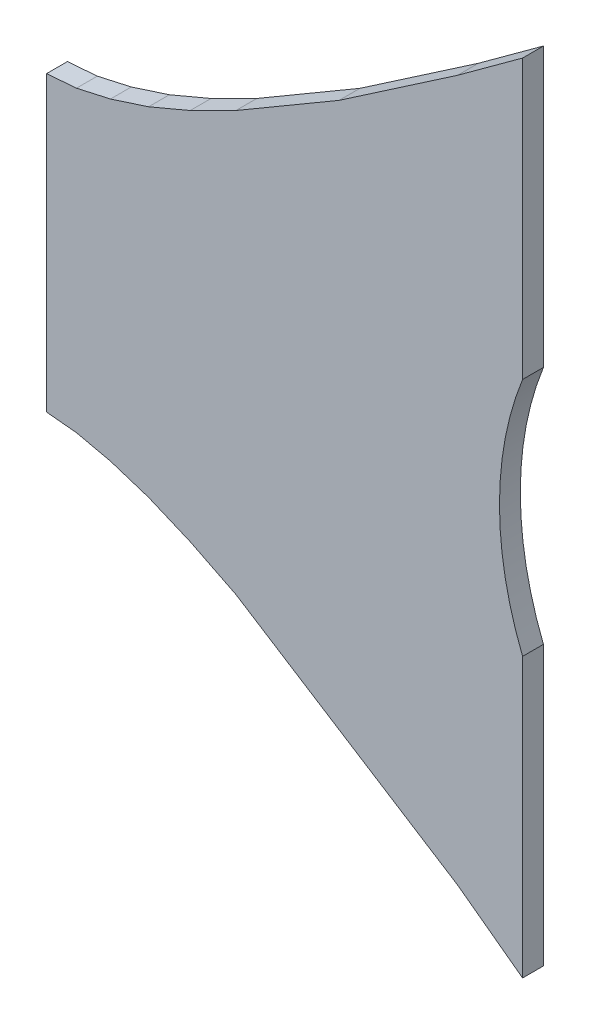
ISO-10303-21;
HEADER;
FILE_DESCRIPTION(('STEP AP214'),'2;1');
FILE_NAME('part.step','',(''),(''),'','','');
FILE_SCHEMA(('AUTOMOTIVE_DESIGN { 1 0 10303 214 1 1 1 1 }'));
ENDSEC;
DATA;
#1=APPLICATION_CONTEXT('core data for automotive mechanical design processes');
#2=APPLICATION_PROTOCOL_DEFINITION('international standard','automotive_design',2000,#1);
#3=PRODUCT_CONTEXT('',#1,'mechanical');
#4=PRODUCT('Part','Part','',(#3));
#5=PRODUCT_RELATED_PRODUCT_CATEGORY('part','',(#4));
#6=PRODUCT_DEFINITION_FORMATION('','',#4);
#7=PRODUCT_DEFINITION_CONTEXT('part definition',#1,'design');
#8=PRODUCT_DEFINITION('design','',#6,#7);
#9=PRODUCT_DEFINITION_SHAPE('','',#8);
#10=(LENGTH_UNIT() NAMED_UNIT(*) SI_UNIT(.MILLI.,.METRE.));
#11=(NAMED_UNIT(*) PLANE_ANGLE_UNIT() SI_UNIT($,.RADIAN.));
#12=(NAMED_UNIT(*) SI_UNIT($,.STERADIAN.) SOLID_ANGLE_UNIT());
#13=UNCERTAINTY_MEASURE_WITH_UNIT(LENGTH_MEASURE(1.E-05),#10,'distance_accuracy_value','');
#14=(GEOMETRIC_REPRESENTATION_CONTEXT(3) GLOBAL_UNCERTAINTY_ASSIGNED_CONTEXT((#13)) GLOBAL_UNIT_ASSIGNED_CONTEXT((#10,
#11,#12)) REPRESENTATION_CONTEXT('',''));
#15=CARTESIAN_POINT('',(0.,0.,0.));
#16=DIRECTION('',(0.,0.,1.));
#17=DIRECTION('',(1.,0.,0.));
#18=AXIS2_PLACEMENT_3D('',#15,#16,#17);
#19=CARTESIAN_POINT('',(102.249000549316,66.4869995117188,0.));
#20=DIRECTION('',(1.,0.,0.));
#21=DIRECTION('',(0.,-1.,0.));
#22=AXIS2_PLACEMENT_3D('',#19,#20,#21);
#23=PLANE('',#22);
#24=DIRECTION('',(0.,-1.,0.));
#25=VECTOR('',#24,1.);
#26=CARTESIAN_POINT('',(102.249000549316,66.4869995117188,0.03556));
#27=LINE('',#26,#25);
#28=CARTESIAN_POINT('',(102.249000549316,66.4869995117188,0.03556));
#29=VERTEX_POINT('',#28);
#30=CARTESIAN_POINT('',(102.249000549316,65.9869995117188,0.03556));
#31=VERTEX_POINT('',#30);
#32=EDGE_CURVE('E11',#29,#31,#27,.T.);
#33=ORIENTED_EDGE('',*,*,#32,.F.);
#34=DIRECTION('',(0.,0.,1.));
#35=VECTOR('',#34,1.);
#36=CARTESIAN_POINT('',(102.249000549316,66.4869995117188,0.));
#37=LINE('',#36,#35);
#38=CARTESIAN_POINT('',(102.249000549316,66.4869995117188,0.));
#39=VERTEX_POINT('',#38);
#40=EDGE_CURVE('E24',#39,#29,#37,.T.);
#41=ORIENTED_EDGE('',*,*,#40,.F.);
#42=DIRECTION('',(0.,-1.,0.));
#43=VECTOR('',#42,1.);
#44=CARTESIAN_POINT('',(102.249000549316,66.4869995117188,0.));
#45=LINE('',#44,#43);
#46=CARTESIAN_POINT('',(102.249000549316,65.9869995117188,0.));
#47=VERTEX_POINT('',#46);
#48=EDGE_CURVE('E297',#39,#47,#45,.T.);
#49=ORIENTED_EDGE('',*,*,#48,.T.);
#50=DIRECTION('',(0.,0.,1.));
#51=VECTOR('',#50,1.);
#52=CARTESIAN_POINT('',(102.249000549316,65.9869995117188,0.));
#53=LINE('',#52,#51);
#54=EDGE_CURVE('E37',#47,#31,#53,.T.);
#55=ORIENTED_EDGE('',*,*,#54,.T.);
#56=EDGE_LOOP('',(#33,#41,#49,#55));
#57=FACE_BOUND('',#56,.T.);
#58=ADVANCED_FACE('F17',(#57),#23,.F.);
#59=CARTESIAN_POINT('',(102.300003051758,66.4909973144531,0.));
#60=DIRECTION('',(0.0781447450221444,-0.996942023803503,0.));
#61=DIRECTION('',(-0.996942023803503,-0.0781447450221444,0.));
#62=AXIS2_PLACEMENT_3D('',#59,#60,#61);
#63=PLANE('',#62);
#64=DIRECTION('',(-0.996942023803503,-0.0781447450221444,0.));
#65=VECTOR('',#64,1.);
#66=CARTESIAN_POINT('',(102.300003051758,66.4909973144531,0.03556));
#67=LINE('',#66,#65);
#68=CARTESIAN_POINT('',(102.300003051758,66.4909973144531,0.03556));
#69=VERTEX_POINT('',#68);
#70=EDGE_CURVE('E293',#69,#29,#67,.T.);
#71=ORIENTED_EDGE('',*,*,#70,.F.);
#72=DIRECTION('',(0.,0.,1.));
#73=VECTOR('',#72,1.);
#74=CARTESIAN_POINT('',(102.300003051758,66.4909973144531,0.));
#75=LINE('',#74,#73);
#76=CARTESIAN_POINT('',(102.300003051758,66.4909973144531,0.));
#77=VERTEX_POINT('',#76);
#78=EDGE_CURVE('E291',#77,#69,#75,.T.);
#79=ORIENTED_EDGE('',*,*,#78,.F.);
#80=DIRECTION('',(-0.996942023803503,-0.0781447450221444,0.));
#81=VECTOR('',#80,1.);
#82=CARTESIAN_POINT('',(102.300003051758,66.4909973144531,0.));
#83=LINE('',#82,#81);
#84=EDGE_CURVE('E289',#77,#39,#83,.T.);
#85=ORIENTED_EDGE('',*,*,#84,.T.);
#86=ORIENTED_EDGE('',*,*,#40,.T.);
#87=EDGE_LOOP('',(#71,#79,#85,#86));
#88=FACE_BOUND('',#87,.T.);
#89=ADVANCED_FACE('F300',(#88),#63,.F.);
#90=CARTESIAN_POINT('',(102.358001708984,66.5039978027344,0.));
#91=DIRECTION('',(0.218724100263412,-0.97578674307656,0.));
#92=DIRECTION('',(-0.97578674307656,-0.218724100263412,0.));
#93=AXIS2_PLACEMENT_3D('',#90,#91,#92);
#94=PLANE('',#93);
#95=DIRECTION('',(-0.97578674307656,-0.218724100263412,0.));
#96=VECTOR('',#95,1.);
#97=CARTESIAN_POINT('',(102.358001708984,66.5039978027344,0.03556));
#98=LINE('',#97,#96);
#99=CARTESIAN_POINT('',(102.358001708984,66.5039978027344,0.03556));
#100=VERTEX_POINT('',#99);
#101=EDGE_CURVE('E286',#100,#69,#98,.T.);
#102=ORIENTED_EDGE('',*,*,#101,.F.);
#103=DIRECTION('',(0.,0.,1.));
#104=VECTOR('',#103,1.);
#105=CARTESIAN_POINT('',(102.358001708984,66.5039978027344,0.));
#106=LINE('',#105,#104);
#107=CARTESIAN_POINT('',(102.358001708984,66.5039978027344,0.));
#108=VERTEX_POINT('',#107);
#109=EDGE_CURVE('E284',#108,#100,#106,.T.);
#110=ORIENTED_EDGE('',*,*,#109,.F.);
#111=DIRECTION('',(-0.97578674307656,-0.218724100263412,0.));
#112=VECTOR('',#111,1.);
#113=CARTESIAN_POINT('',(102.358001708984,66.5039978027344,0.));
#114=LINE('',#113,#112);
#115=EDGE_CURVE('E281',#108,#77,#114,.T.);
#116=ORIENTED_EDGE('',*,*,#115,.T.);
#117=ORIENTED_EDGE('',*,*,#78,.T.);
#118=EDGE_LOOP('',(#102,#110,#116,#117));
#119=FACE_BOUND('',#118,.T.);
#120=ADVANCED_FACE('F303',(#119),#94,.F.);
#121=CARTESIAN_POINT('',(102.422996520996,66.5250015258789,0.));
#122=DIRECTION('',(0.307502058352941,-0.951547415586162,0.));
#123=DIRECTION('',(-0.951547415586162,-0.307502058352941,0.));
#124=AXIS2_PLACEMENT_3D('',#121,#122,#123);
#125=PLANE('',#124);
#126=DIRECTION('',(-0.951547415586162,-0.307502058352941,0.));
#127=VECTOR('',#126,1.);
#128=CARTESIAN_POINT('',(102.422996520996,66.5250015258789,0.03556));
#129=LINE('',#128,#127);
#130=CARTESIAN_POINT('',(102.422996520996,66.5250015258789,0.03556));
#131=VERTEX_POINT('',#130);
#132=EDGE_CURVE('E278',#131,#100,#129,.T.);
#133=ORIENTED_EDGE('',*,*,#132,.F.);
#134=DIRECTION('',(0.,0.,1.));
#135=VECTOR('',#134,1.);
#136=CARTESIAN_POINT('',(102.422996520996,66.5250015258789,0.));
#137=LINE('',#136,#135);
#138=CARTESIAN_POINT('',(102.422996520996,66.5250015258789,0.));
#139=VERTEX_POINT('',#138);
#140=EDGE_CURVE('E276',#139,#131,#137,.T.);
#141=ORIENTED_EDGE('',*,*,#140,.F.);
#142=DIRECTION('',(-0.951547415586162,-0.307502058352941,0.));
#143=VECTOR('',#142,1.);
#144=CARTESIAN_POINT('',(102.422996520996,66.5250015258789,0.));
#145=LINE('',#144,#143);
#146=EDGE_CURVE('E273',#139,#108,#145,.T.);
#147=ORIENTED_EDGE('',*,*,#146,.T.);
#148=ORIENTED_EDGE('',*,*,#109,.T.);
#149=EDGE_LOOP('',(#133,#141,#147,#148));
#150=FACE_BOUND('',#149,.T.);
#151=ADVANCED_FACE('F308',(#150),#125,.F.);
#152=CARTESIAN_POINT('',(102.494003295898,66.5550003051758,0.));
#153=DIRECTION('',(0.389171762664028,-0.921165207302672,0.));
#154=DIRECTION('',(-0.921165207302672,-0.389171762664028,0.));
#155=AXIS2_PLACEMENT_3D('',#152,#153,#154);
#156=PLANE('',#155);
#157=DIRECTION('',(-0.921165207302672,-0.389171762664028,0.));
#158=VECTOR('',#157,1.);
#159=CARTESIAN_POINT('',(102.494003295898,66.5550003051758,0.03556));
#160=LINE('',#159,#158);
#161=CARTESIAN_POINT('',(102.494003295898,66.5550003051758,0.03556));
#162=VERTEX_POINT('',#161);
#163=EDGE_CURVE('E270',#162,#131,#160,.T.);
#164=ORIENTED_EDGE('',*,*,#163,.F.);
#165=DIRECTION('',(0.,0.,1.));
#166=VECTOR('',#165,1.);
#167=CARTESIAN_POINT('',(102.494003295898,66.5550003051758,0.));
#168=LINE('',#167,#166);
#169=CARTESIAN_POINT('',(102.494003295898,66.5550003051758,0.));
#170=VERTEX_POINT('',#169);
#171=EDGE_CURVE('E268',#170,#162,#168,.T.);
#172=ORIENTED_EDGE('',*,*,#171,.F.);
#173=DIRECTION('',(-0.921165207302672,-0.389171762664028,0.));
#174=VECTOR('',#173,1.);
#175=CARTESIAN_POINT('',(102.494003295898,66.5550003051758,0.));
#176=LINE('',#175,#174);
#177=EDGE_CURVE('E265',#170,#139,#176,.T.);
#178=ORIENTED_EDGE('',*,*,#177,.T.);
#179=ORIENTED_EDGE('',*,*,#140,.T.);
#180=EDGE_LOOP('',(#164,#172,#178,#179));
#181=FACE_BOUND('',#180,.T.);
#182=ADVANCED_FACE('F311',(#181),#156,.F.);
#183=CARTESIAN_POINT('',(102.571998596191,66.5940017700195,0.));
#184=DIRECTION('',(0.447248591135036,-0.894409692326579,0.));
#185=DIRECTION('',(-0.894409692326579,-0.447248591135036,0.));
#186=AXIS2_PLACEMENT_3D('',#183,#184,#185);
#187=PLANE('',#186);
#188=DIRECTION('',(-0.894409692326579,-0.447248591135036,0.));
#189=VECTOR('',#188,1.);
#190=CARTESIAN_POINT('',(102.571998596191,66.5940017700195,0.03556));
#191=LINE('',#190,#189);
#192=CARTESIAN_POINT('',(102.571998596191,66.5940017700195,0.03556));
#193=VERTEX_POINT('',#192);
#194=EDGE_CURVE('E262',#193,#162,#191,.T.);
#195=ORIENTED_EDGE('',*,*,#194,.F.);
#196=DIRECTION('',(0.,0.,1.));
#197=VECTOR('',#196,1.);
#198=CARTESIAN_POINT('',(102.571998596191,66.5940017700195,0.));
#199=LINE('',#198,#197);
#200=CARTESIAN_POINT('',(102.571998596191,66.5940017700195,0.));
#201=VERTEX_POINT('',#200);
#202=EDGE_CURVE('E260',#201,#193,#199,.T.);
#203=ORIENTED_EDGE('',*,*,#202,.F.);
#204=DIRECTION('',(-0.894409692326579,-0.447248591135036,0.));
#205=VECTOR('',#204,1.);
#206=CARTESIAN_POINT('',(102.571998596191,66.5940017700195,0.));
#207=LINE('',#206,#205);
#208=EDGE_CURVE('E257',#201,#170,#207,.T.);
#209=ORIENTED_EDGE('',*,*,#208,.T.);
#210=ORIENTED_EDGE('',*,*,#171,.T.);
#211=EDGE_LOOP('',(#195,#203,#209,#210));
#212=FACE_BOUND('',#211,.T.);
#213=ADVANCED_FACE('F316',(#212),#187,.F.);
#214=CARTESIAN_POINT('',(102.748001098633,66.6969985961914,0.));
#215=DIRECTION('',(0.50507317540555,-0.863076524698566,0.));
#216=DIRECTION('',(-0.863076524698566,-0.50507317540555,0.));
#217=AXIS2_PLACEMENT_3D('',#214,#215,#216);
#218=PLANE('',#217);
#219=DIRECTION('',(-0.863076524698566,-0.50507317540555,0.));
#220=VECTOR('',#219,1.);
#221=CARTESIAN_POINT('',(102.748001098633,66.6969985961914,0.03556));
#222=LINE('',#221,#220);
#223=CARTESIAN_POINT('',(102.748001098633,66.6969985961914,0.03556));
#224=VERTEX_POINT('',#223);
#225=EDGE_CURVE('E254',#224,#193,#222,.T.);
#226=ORIENTED_EDGE('',*,*,#225,.F.);
#227=DIRECTION('',(0.,0.,1.));
#228=VECTOR('',#227,1.);
#229=CARTESIAN_POINT('',(102.748001098633,66.6969985961914,0.));
#230=LINE('',#229,#228);
#231=CARTESIAN_POINT('',(102.748001098633,66.6969985961914,0.));
#232=VERTEX_POINT('',#231);
#233=EDGE_CURVE('E252',#232,#224,#230,.T.);
#234=ORIENTED_EDGE('',*,*,#233,.F.);
#235=DIRECTION('',(-0.863076524698566,-0.50507317540555,0.));
#236=VECTOR('',#235,1.);
#237=CARTESIAN_POINT('',(102.748001098633,66.6969985961914,0.));
#238=LINE('',#237,#236);
#239=EDGE_CURVE('E249',#232,#201,#238,.T.);
#240=ORIENTED_EDGE('',*,*,#239,.T.);
#241=ORIENTED_EDGE('',*,*,#202,.T.);
#242=EDGE_LOOP('',(#226,#234,#240,#241));
#243=FACE_BOUND('',#242,.T.);
#244=ADVANCED_FACE('F319',(#243),#218,.F.);
#245=CARTESIAN_POINT('',(102.949996948242,66.8349990844727,0.));
#246=DIRECTION('',(0.564106880635781,-0.8257017786219,0.));
#247=DIRECTION('',(-0.8257017786219,-0.564106880635781,0.));
#248=AXIS2_PLACEMENT_3D('',#245,#246,#247);
#249=PLANE('',#248);
#250=DIRECTION('',(-0.8257017786219,-0.564106880635781,0.));
#251=VECTOR('',#250,1.);
#252=CARTESIAN_POINT('',(102.949996948242,66.8349990844727,0.03556));
#253=LINE('',#252,#251);
#254=CARTESIAN_POINT('',(102.949996948242,66.8349990844727,0.03556));
#255=VERTEX_POINT('',#254);
#256=EDGE_CURVE('E246',#255,#224,#253,.T.);
#257=ORIENTED_EDGE('',*,*,#256,.F.);
#258=DIRECTION('',(0.,0.,1.));
#259=VECTOR('',#258,1.);
#260=CARTESIAN_POINT('',(102.949996948242,66.8349990844727,0.));
#261=LINE('',#260,#259);
#262=CARTESIAN_POINT('',(102.949996948242,66.8349990844727,0.));
#263=VERTEX_POINT('',#262);
#264=EDGE_CURVE('E244',#263,#255,#261,.T.);
#265=ORIENTED_EDGE('',*,*,#264,.F.);
#266=DIRECTION('',(-0.8257017786219,-0.564106880635781,0.));
#267=VECTOR('',#266,1.);
#268=CARTESIAN_POINT('',(102.949996948242,66.8349990844727,0.));
#269=LINE('',#268,#267);
#270=EDGE_CURVE('E241',#263,#232,#269,.T.);
#271=ORIENTED_EDGE('',*,*,#270,.T.);
#272=ORIENTED_EDGE('',*,*,#233,.T.);
#273=EDGE_LOOP('',(#257,#265,#271,#272));
#274=FACE_BOUND('',#273,.T.);
#275=ADVANCED_FACE('F324',(#274),#249,.F.);
#276=CARTESIAN_POINT('',(103.060997009277,66.9160003662109,0.));
#277=DIRECTION('',(0.589474945086485,-0.807786660644558,0.));
#278=DIRECTION('',(-0.807786660644558,-0.589474945086485,0.));
#279=AXIS2_PLACEMENT_3D('',#276,#277,#278);
#280=PLANE('',#279);
#281=DIRECTION('',(-0.807786660644558,-0.589474945086485,0.));
#282=VECTOR('',#281,1.);
#283=CARTESIAN_POINT('',(103.060997009277,66.9160003662109,0.03556));
#284=LINE('',#283,#282);
#285=CARTESIAN_POINT('',(103.060997009277,66.9160003662109,0.03556));
#286=VERTEX_POINT('',#285);
#287=EDGE_CURVE('E238',#286,#255,#284,.T.);
#288=ORIENTED_EDGE('',*,*,#287,.F.);
#289=DIRECTION('',(0.,0.,1.));
#290=VECTOR('',#289,1.);
#291=CARTESIAN_POINT('',(103.060997009277,66.9160003662109,0.));
#292=LINE('',#291,#290);
#293=CARTESIAN_POINT('',(103.060997009277,66.9160003662109,0.));
#294=VERTEX_POINT('',#293);
#295=EDGE_CURVE('E236',#294,#286,#292,.T.);
#296=ORIENTED_EDGE('',*,*,#295,.F.);
#297=DIRECTION('',(-0.807786660644558,-0.589474945086485,0.));
#298=VECTOR('',#297,1.);
#299=CARTESIAN_POINT('',(103.060997009277,66.9160003662109,0.));
#300=LINE('',#299,#298);
#301=EDGE_CURVE('E233',#294,#263,#300,.T.);
#302=ORIENTED_EDGE('',*,*,#301,.T.);
#303=ORIENTED_EDGE('',*,*,#264,.T.);
#304=EDGE_LOOP('',(#288,#296,#302,#303));
#305=FACE_BOUND('',#304,.T.);
#306=ADVANCED_FACE('F327',(#305),#280,.F.);
#307=CARTESIAN_POINT('',(103.060997009277,66.4411864682146,0.));
#308=DIRECTION('',(-1.,0.,0.));
#309=DIRECTION('',(0.,1.,0.));
#310=AXIS2_PLACEMENT_3D('',#307,#308,#309);
#311=PLANE('',#310);
#312=DIRECTION('',(0.,1.,0.));
#313=VECTOR('',#312,1.);
#314=CARTESIAN_POINT('',(103.060997009277,65.556999206543,0.03556));
#315=LINE('',#314,#313);
#316=CARTESIAN_POINT('',(103.060997009277,66.4411864682146,0.03556));
#317=VERTEX_POINT('',#316);
#318=EDGE_CURVE('E230',#317,#286,#315,.T.);
#319=ORIENTED_EDGE('',*,*,#318,.F.);
#320=DIRECTION('',(0.,0.,1.));
#321=VECTOR('',#320,1.);
#322=CARTESIAN_POINT('',(103.060997009277,66.4411864682146,0.));
#323=LINE('',#322,#321);
#324=CARTESIAN_POINT('',(103.060997009277,66.4411864682146,0.));
#325=VERTEX_POINT('',#324);
#326=EDGE_CURVE('E228',#325,#317,#323,.T.);
#327=ORIENTED_EDGE('',*,*,#326,.F.);
#328=DIRECTION('',(0.,1.,0.));
#329=VECTOR('',#328,1.);
#330=CARTESIAN_POINT('',(103.060997009277,65.556999206543,0.));
#331=LINE('',#330,#329);
#332=EDGE_CURVE('E225',#325,#294,#331,.T.);
#333=ORIENTED_EDGE('',*,*,#332,.T.);
#334=ORIENTED_EDGE('',*,*,#295,.T.);
#335=EDGE_LOOP('',(#319,#327,#333,#334));
#336=FACE_BOUND('',#335,.T.);
#337=ADVANCED_FACE('F332',(#336),#311,.F.);
#338=CARTESIAN_POINT('',(103.571548,66.2366468,0.));
#339=DIRECTION('',(0.,0.,-1.));
#340=DIRECTION('',(1.,0.,0.));
#341=AXIS2_PLACEMENT_3D('',#338,#339,#340);
#342=CYLINDRICAL_SURFACE('',#341,0.5499989);
#343=ORIENTED_EDGE('',*,*,#326,.T.);
#344=CARTESIAN_POINT('',(103.571548,66.2366468,0.03556));
#345=DIRECTION('',(0.,0.,1.));
#346=DIRECTION('',(1.,0.,0.));
#347=AXIS2_PLACEMENT_3D('',#344,#345,#346);
#348=CIRCLE('',#347,0.5499989);
#349=CARTESIAN_POINT('',(103.060997009277,66.0321071317854,0.03556));
#350=VERTEX_POINT('',#349);
#351=EDGE_CURVE('E222',#317,#350,#348,.T.);
#352=ORIENTED_EDGE('',*,*,#351,.T.);
#353=DIRECTION('',(0.,0.,1.));
#354=VECTOR('',#353,1.);
#355=CARTESIAN_POINT('',(103.060997009277,66.0321071317854,0.));
#356=LINE('',#355,#354);
#357=CARTESIAN_POINT('',(103.060997009277,66.0321071317854,0.));
#358=VERTEX_POINT('',#357);
#359=EDGE_CURVE('E220',#358,#350,#356,.T.);
#360=ORIENTED_EDGE('',*,*,#359,.F.);
#361=CARTESIAN_POINT('',(103.571548,66.2366468,0.));
#362=DIRECTION('',(0.,0.,1.));
#363=DIRECTION('',(1.,0.,0.));
#364=AXIS2_PLACEMENT_3D('',#361,#362,#363);
#365=CIRCLE('',#364,0.5499989);
#366=EDGE_CURVE('E217',#325,#358,#365,.T.);
#367=ORIENTED_EDGE('',*,*,#366,.F.);
#368=EDGE_LOOP('',(#343,#352,#360,#367));
#369=FACE_BOUND('',#368,.T.);
#370=ADVANCED_FACE('F335',(#369),#342,.F.);
#371=CARTESIAN_POINT('',(103.060997009277,65.556999206543,0.));
#372=DIRECTION('',(-1.,0.,0.));
#373=DIRECTION('',(0.,1.,0.));
#374=AXIS2_PLACEMENT_3D('',#371,#372,#373);
#375=PLANE('',#374);
#376=DIRECTION('',(0.,1.,0.));
#377=VECTOR('',#376,1.);
#378=CARTESIAN_POINT('',(103.060997009277,65.556999206543,0.03556));
#379=LINE('',#378,#377);
#380=CARTESIAN_POINT('',(103.060997009277,65.556999206543,0.03556));
#381=VERTEX_POINT('',#380);
#382=EDGE_CURVE('E214',#381,#350,#379,.T.);
#383=ORIENTED_EDGE('',*,*,#382,.F.);
#384=DIRECTION('',(0.,0.,1.));
#385=VECTOR('',#384,1.);
#386=CARTESIAN_POINT('',(103.060997009277,65.556999206543,0.));
#387=LINE('',#386,#385);
#388=CARTESIAN_POINT('',(103.060997009277,65.556999206543,0.));
#389=VERTEX_POINT('',#388);
#390=EDGE_CURVE('E212',#389,#381,#387,.T.);
#391=ORIENTED_EDGE('',*,*,#390,.F.);
#392=EDGE_CURVE('E211',#389,#358,#331,.T.);
#393=ORIENTED_EDGE('',*,*,#392,.T.);
#394=ORIENTED_EDGE('',*,*,#359,.T.);
#395=EDGE_LOOP('',(#383,#391,#393,#394));
#396=FACE_BOUND('',#395,.T.);
#397=ADVANCED_FACE('F341',(#396),#375,.F.);
#398=CARTESIAN_POINT('',(102.949996948242,65.6389999389648,0.));
#399=DIRECTION('',(0.594190520477867,0.804324328473435,0.));
#400=DIRECTION('',(0.804324328473435,-0.594190520477867,0.));
#401=AXIS2_PLACEMENT_3D('',#398,#399,#400);
#402=PLANE('',#401);
#403=DIRECTION('',(0.804324328473435,-0.594190520477867,0.));
#404=VECTOR('',#403,1.);
#405=CARTESIAN_POINT('',(102.949996948242,65.6389999389648,0.03556));
#406=LINE('',#405,#404);
#407=CARTESIAN_POINT('',(102.949996948242,65.6389999389648,0.03556));
#408=VERTEX_POINT('',#407);
#409=EDGE_CURVE('E208',#408,#381,#406,.T.);
#410=ORIENTED_EDGE('',*,*,#409,.F.);
#411=DIRECTION('',(0.,0.,1.));
#412=VECTOR('',#411,1.);
#413=CARTESIAN_POINT('',(102.949996948242,65.6389999389648,0.));
#414=LINE('',#413,#412);
#415=CARTESIAN_POINT('',(102.949996948242,65.6389999389648,0.));
#416=VERTEX_POINT('',#415);
#417=EDGE_CURVE('E206',#416,#408,#414,.T.);
#418=ORIENTED_EDGE('',*,*,#417,.F.);
#419=DIRECTION('',(0.804324328473435,-0.594190520477867,0.));
#420=VECTOR('',#419,1.);
#421=CARTESIAN_POINT('',(102.949996948242,65.6389999389648,0.));
#422=LINE('',#421,#420);
#423=EDGE_CURVE('E203',#416,#389,#422,.T.);
#424=ORIENTED_EDGE('',*,*,#423,.T.);
#425=ORIENTED_EDGE('',*,*,#390,.T.);
#426=EDGE_LOOP('',(#410,#418,#424,#425));
#427=FACE_BOUND('',#426,.T.);
#428=ADVANCED_FACE('F344',(#427),#402,.F.);
#429=CARTESIAN_POINT('',(102.571998596191,65.8789978027344,0.));
#430=DIRECTION('',(0.536006401827782,0.844213916729423,0.));
#431=DIRECTION('',(0.844213916729423,-0.536006401827782,0.));
#432=AXIS2_PLACEMENT_3D('',#429,#430,#431);
#433=PLANE('',#432);
#434=DIRECTION('',(0.844213916729423,-0.536006401827782,0.));
#435=VECTOR('',#434,1.);
#436=CARTESIAN_POINT('',(102.571998596191,65.8789978027344,0.03556));
#437=LINE('',#436,#435);
#438=CARTESIAN_POINT('',(102.571998596191,65.8789978027344,0.03556));
#439=VERTEX_POINT('',#438);
#440=EDGE_CURVE('E200',#439,#408,#437,.T.);
#441=ORIENTED_EDGE('',*,*,#440,.F.);
#442=DIRECTION('',(0.,0.,1.));
#443=VECTOR('',#442,1.);
#444=CARTESIAN_POINT('',(102.571998596191,65.8789978027344,0.));
#445=LINE('',#444,#443);
#446=CARTESIAN_POINT('',(102.571998596191,65.8789978027344,0.));
#447=VERTEX_POINT('',#446);
#448=EDGE_CURVE('E198',#447,#439,#445,.T.);
#449=ORIENTED_EDGE('',*,*,#448,.F.);
#450=DIRECTION('',(0.844213916729423,-0.536006401827782,0.));
#451=VECTOR('',#450,1.);
#452=CARTESIAN_POINT('',(102.571998596191,65.8789978027344,0.));
#453=LINE('',#452,#451);
#454=EDGE_CURVE('E195',#447,#416,#453,.T.);
#455=ORIENTED_EDGE('',*,*,#454,.T.);
#456=ORIENTED_EDGE('',*,*,#417,.T.);
#457=EDGE_LOOP('',(#441,#449,#455,#456));
#458=FACE_BOUND('',#457,.T.);
#459=ADVANCED_FACE('F349',(#458),#433,.F.);
#460=CARTESIAN_POINT('',(102.494003295898,65.9179992675781,0.));
#461=DIRECTION('',(0.447248591135036,0.894409692326579,0.));
#462=DIRECTION('',(0.894409692326579,-0.447248591135036,0.));
#463=AXIS2_PLACEMENT_3D('',#460,#461,#462);
#464=PLANE('',#463);
#465=DIRECTION('',(0.894409692326579,-0.447248591135036,0.));
#466=VECTOR('',#465,1.);
#467=CARTESIAN_POINT('',(102.494003295898,65.9179992675781,0.03556));
#468=LINE('',#467,#466);
#469=CARTESIAN_POINT('',(102.494003295898,65.9179992675781,0.03556));
#470=VERTEX_POINT('',#469);
#471=EDGE_CURVE('E192',#470,#439,#468,.T.);
#472=ORIENTED_EDGE('',*,*,#471,.F.);
#473=DIRECTION('',(0.,0.,1.));
#474=VECTOR('',#473,1.);
#475=CARTESIAN_POINT('',(102.494003295898,65.9179992675781,0.));
#476=LINE('',#475,#474);
#477=CARTESIAN_POINT('',(102.494003295898,65.9179992675781,0.));
#478=VERTEX_POINT('',#477);
#479=EDGE_CURVE('E190',#478,#470,#476,.T.);
#480=ORIENTED_EDGE('',*,*,#479,.F.);
#481=DIRECTION('',(0.894409692326579,-0.447248591135036,0.));
#482=VECTOR('',#481,1.);
#483=CARTESIAN_POINT('',(102.494003295898,65.9179992675781,0.));
#484=LINE('',#483,#482);
#485=EDGE_CURVE('E187',#478,#447,#484,.T.);
#486=ORIENTED_EDGE('',*,*,#485,.T.);
#487=ORIENTED_EDGE('',*,*,#448,.T.);
#488=EDGE_LOOP('',(#472,#480,#486,#487));
#489=FACE_BOUND('',#488,.T.);
#490=ADVANCED_FACE('F352',(#489),#464,.F.);
#491=CARTESIAN_POINT('',(102.422996520996,65.947998046875,0.));
#492=DIRECTION('',(0.389171762664028,0.921165207302672,0.));
#493=DIRECTION('',(0.921165207302672,-0.389171762664028,0.));
#494=AXIS2_PLACEMENT_3D('',#491,#492,#493);
#495=PLANE('',#494);
#496=DIRECTION('',(0.921165207302672,-0.389171762664028,0.));
#497=VECTOR('',#496,1.);
#498=CARTESIAN_POINT('',(102.422996520996,65.947998046875,0.03556));
#499=LINE('',#498,#497);
#500=CARTESIAN_POINT('',(102.422996520996,65.947998046875,0.03556));
#501=VERTEX_POINT('',#500);
#502=EDGE_CURVE('E184',#501,#470,#499,.T.);
#503=ORIENTED_EDGE('',*,*,#502,.F.);
#504=DIRECTION('',(0.,0.,1.));
#505=VECTOR('',#504,1.);
#506=CARTESIAN_POINT('',(102.422996520996,65.947998046875,0.));
#507=LINE('',#506,#505);
#508=CARTESIAN_POINT('',(102.422996520996,65.947998046875,0.));
#509=VERTEX_POINT('',#508);
#510=EDGE_CURVE('E182',#509,#501,#507,.T.);
#511=ORIENTED_EDGE('',*,*,#510,.F.);
#512=DIRECTION('',(0.921165207302672,-0.389171762664028,0.));
#513=VECTOR('',#512,1.);
#514=CARTESIAN_POINT('',(102.422996520996,65.947998046875,0.));
#515=LINE('',#514,#513);
#516=EDGE_CURVE('E179',#509,#478,#515,.T.);
#517=ORIENTED_EDGE('',*,*,#516,.T.);
#518=ORIENTED_EDGE('',*,*,#479,.T.);
#519=EDGE_LOOP('',(#503,#511,#517,#518));
#520=FACE_BOUND('',#519,.T.);
#521=ADVANCED_FACE('F355',(#520),#495,.F.);
#522=CARTESIAN_POINT('',(102.358001708984,65.9690017700195,0.));
#523=DIRECTION('',(0.307502058352941,0.951547415586162,0.));
#524=DIRECTION('',(0.951547415586162,-0.307502058352941,0.));
#525=AXIS2_PLACEMENT_3D('',#522,#523,#524);
#526=PLANE('',#525);
#527=DIRECTION('',(0.951547415586162,-0.307502058352941,0.));
#528=VECTOR('',#527,1.);
#529=CARTESIAN_POINT('',(102.358001708984,65.9690017700195,0.03556));
#530=LINE('',#529,#528);
#531=CARTESIAN_POINT('',(102.358001708984,65.9690017700195,0.03556));
#532=VERTEX_POINT('',#531);
#533=EDGE_CURVE('E176',#532,#501,#530,.T.);
#534=ORIENTED_EDGE('',*,*,#533,.F.);
#535=DIRECTION('',(0.,0.,1.));
#536=VECTOR('',#535,1.);
#537=CARTESIAN_POINT('',(102.358001708984,65.9690017700195,0.));
#538=LINE('',#537,#536);
#539=CARTESIAN_POINT('',(102.358001708984,65.9690017700195,0.));
#540=VERTEX_POINT('',#539);
#541=EDGE_CURVE('E174',#540,#532,#538,.T.);
#542=ORIENTED_EDGE('',*,*,#541,.F.);
#543=DIRECTION('',(0.951547415586162,-0.307502058352941,0.));
#544=VECTOR('',#543,1.);
#545=CARTESIAN_POINT('',(102.358001708984,65.9690017700195,0.));
#546=LINE('',#545,#544);
#547=EDGE_CURVE('E165',#540,#509,#546,.T.);
#548=ORIENTED_EDGE('',*,*,#547,.T.);
#549=ORIENTED_EDGE('',*,*,#510,.T.);
#550=EDGE_LOOP('',(#534,#542,#548,#549));
#551=FACE_BOUND('',#550,.T.);
#552=ADVANCED_FACE('F358',(#551),#526,.F.);
#553=CARTESIAN_POINT('',(102.300003051758,65.9820022583008,0.));
#554=DIRECTION('',(0.218724100263412,0.97578674307656,0.));
#555=DIRECTION('',(0.97578674307656,-0.218724100263412,0.));
#556=AXIS2_PLACEMENT_3D('',#553,#554,#555);
#557=PLANE('',#556);
#558=DIRECTION('',(0.97578674307656,-0.218724100263412,0.));
#559=VECTOR('',#558,1.);
#560=CARTESIAN_POINT('',(102.300003051758,65.9820022583008,0.03556));
#561=LINE('',#560,#559);
#562=CARTESIAN_POINT('',(102.300003051758,65.9820022583008,0.03556));
#563=VERTEX_POINT('',#562);
#564=EDGE_CURVE('E151',#563,#532,#561,.T.);
#565=ORIENTED_EDGE('',*,*,#564,.F.);
#566=DIRECTION('',(0.,0.,1.));
#567=VECTOR('',#566,1.);
#568=CARTESIAN_POINT('',(102.300003051758,65.9820022583008,0.));
#569=LINE('',#568,#567);
#570=CARTESIAN_POINT('',(102.300003051758,65.9820022583008,0.));
#571=VERTEX_POINT('',#570);
#572=EDGE_CURVE('E146',#571,#563,#569,.T.);
#573=ORIENTED_EDGE('',*,*,#572,.F.);
#574=DIRECTION('',(0.97578674307656,-0.218724100263412,0.));
#575=VECTOR('',#574,1.);
#576=CARTESIAN_POINT('',(102.300003051758,65.9820022583008,0.));
#577=LINE('',#576,#575);
#578=EDGE_CURVE('E149',#571,#540,#577,.T.);
#579=ORIENTED_EDGE('',*,*,#578,.T.);
#580=ORIENTED_EDGE('',*,*,#541,.T.);
#581=EDGE_LOOP('',(#565,#573,#579,#580));
#582=FACE_BOUND('',#581,.T.);
#583=ADVANCED_FACE('F148',(#582),#557,.F.);
#584=CARTESIAN_POINT('',(102.249000549316,65.9869995117188,0.));
#585=DIRECTION('',(0.0975135970444679,0.995234192736287,0.));
#586=DIRECTION('',(0.995234192736287,-0.0975135970444679,0.));
#587=AXIS2_PLACEMENT_3D('',#584,#585,#586);
#588=PLANE('',#587);
#589=DIRECTION('',(0.995234192736287,-0.0975135970444679,0.));
#590=VECTOR('',#589,1.);
#591=CARTESIAN_POINT('',(102.249000549316,65.9869995117188,0.03556));
#592=LINE('',#591,#590);
#593=EDGE_CURVE('E166',#31,#563,#592,.T.);
#594=ORIENTED_EDGE('',*,*,#593,.F.);
#595=ORIENTED_EDGE('',*,*,#54,.F.);
#596=DIRECTION('',(0.995234192736287,-0.0975135970444679,0.));
#597=VECTOR('',#596,1.);
#598=CARTESIAN_POINT('',(102.249000549316,65.9869995117188,0.));
#599=LINE('',#598,#597);
#600=EDGE_CURVE('E162',#47,#571,#599,.T.);
#601=ORIENTED_EDGE('',*,*,#600,.T.);
#602=ORIENTED_EDGE('',*,*,#572,.T.);
#603=EDGE_LOOP('',(#594,#595,#601,#602));
#604=FACE_BOUND('',#603,.T.);
#605=ADVANCED_FACE('F168',(#604),#588,.F.);
#606=CARTESIAN_POINT('',(102.249000549316,65.9869995117188,0.));
#607=DIRECTION('',(0.,0.,1.));
#608=DIRECTION('',(1.,0.,0.));
#609=AXIS2_PLACEMENT_3D('',#606,#607,#608);
#610=PLANE('',#609);
#611=ORIENTED_EDGE('',*,*,#600,.F.);
#612=ORIENTED_EDGE('',*,*,#48,.F.);
#613=ORIENTED_EDGE('',*,*,#84,.F.);
#614=ORIENTED_EDGE('',*,*,#115,.F.);
#615=ORIENTED_EDGE('',*,*,#146,.F.);
#616=ORIENTED_EDGE('',*,*,#177,.F.);
#617=ORIENTED_EDGE('',*,*,#208,.F.);
#618=ORIENTED_EDGE('',*,*,#239,.F.);
#619=ORIENTED_EDGE('',*,*,#270,.F.);
#620=ORIENTED_EDGE('',*,*,#301,.F.);
#621=ORIENTED_EDGE('',*,*,#332,.F.);
#622=ORIENTED_EDGE('',*,*,#366,.T.);
#623=ORIENTED_EDGE('',*,*,#392,.F.);
#624=ORIENTED_EDGE('',*,*,#423,.F.);
#625=ORIENTED_EDGE('',*,*,#454,.F.);
#626=ORIENTED_EDGE('',*,*,#485,.F.);
#627=ORIENTED_EDGE('',*,*,#516,.F.);
#628=ORIENTED_EDGE('',*,*,#547,.F.);
#629=ORIENTED_EDGE('',*,*,#578,.F.);
#630=EDGE_LOOP('',(#611,#612,#613,#614,#615,#616,#617,#618,#619,#620,#621,#622,#623,#624,#625,
#626,#627,#628,#629));
#631=FACE_BOUND('',#630,.T.);
#632=ADVANCED_FACE('F160',(#631),#610,.F.);
#633=CARTESIAN_POINT('',(102.249000549316,65.9869995117188,0.03556));
#634=DIRECTION('',(0.,0.,1.));
#635=DIRECTION('',(1.,0.,0.));
#636=AXIS2_PLACEMENT_3D('',#633,#634,#635);
#637=PLANE('',#636);
#638=ORIENTED_EDGE('',*,*,#32,.T.);
#639=ORIENTED_EDGE('',*,*,#593,.T.);
#640=ORIENTED_EDGE('',*,*,#564,.T.);
#641=ORIENTED_EDGE('',*,*,#533,.T.);
#642=ORIENTED_EDGE('',*,*,#502,.T.);
#643=ORIENTED_EDGE('',*,*,#471,.T.);
#644=ORIENTED_EDGE('',*,*,#440,.T.);
#645=ORIENTED_EDGE('',*,*,#409,.T.);
#646=ORIENTED_EDGE('',*,*,#382,.T.);
#647=ORIENTED_EDGE('',*,*,#351,.F.);
#648=ORIENTED_EDGE('',*,*,#318,.T.);
#649=ORIENTED_EDGE('',*,*,#287,.T.);
#650=ORIENTED_EDGE('',*,*,#256,.T.);
#651=ORIENTED_EDGE('',*,*,#225,.T.);
#652=ORIENTED_EDGE('',*,*,#194,.T.);
#653=ORIENTED_EDGE('',*,*,#163,.T.);
#654=ORIENTED_EDGE('',*,*,#132,.T.);
#655=ORIENTED_EDGE('',*,*,#101,.T.);
#656=ORIENTED_EDGE('',*,*,#70,.T.);
#657=EDGE_LOOP('',(#638,#639,#640,#641,#642,#643,#644,#645,#646,#647,#648,#649,#650,#651,#652,
#653,#654,#655,#656));
#658=FACE_BOUND('',#657,.T.);
#659=ADVANCED_FACE('F360',(#658),#637,.T.);
#660=CLOSED_SHELL('',(#58,#89,#120,#151,#182,#213,#244,#275,#306,#337,#370,#397,#428,#459,#490,
#521,#552,#583,#605,#632,#659));
#661=MANIFOLD_SOLID_BREP('B1',#660);
#662=ADVANCED_BREP_SHAPE_REPRESENTATION('',(#18,#661),#14);
#663=SHAPE_DEFINITION_REPRESENTATION(#9,#662);
ENDSEC;
END-ISO-10303-21;
